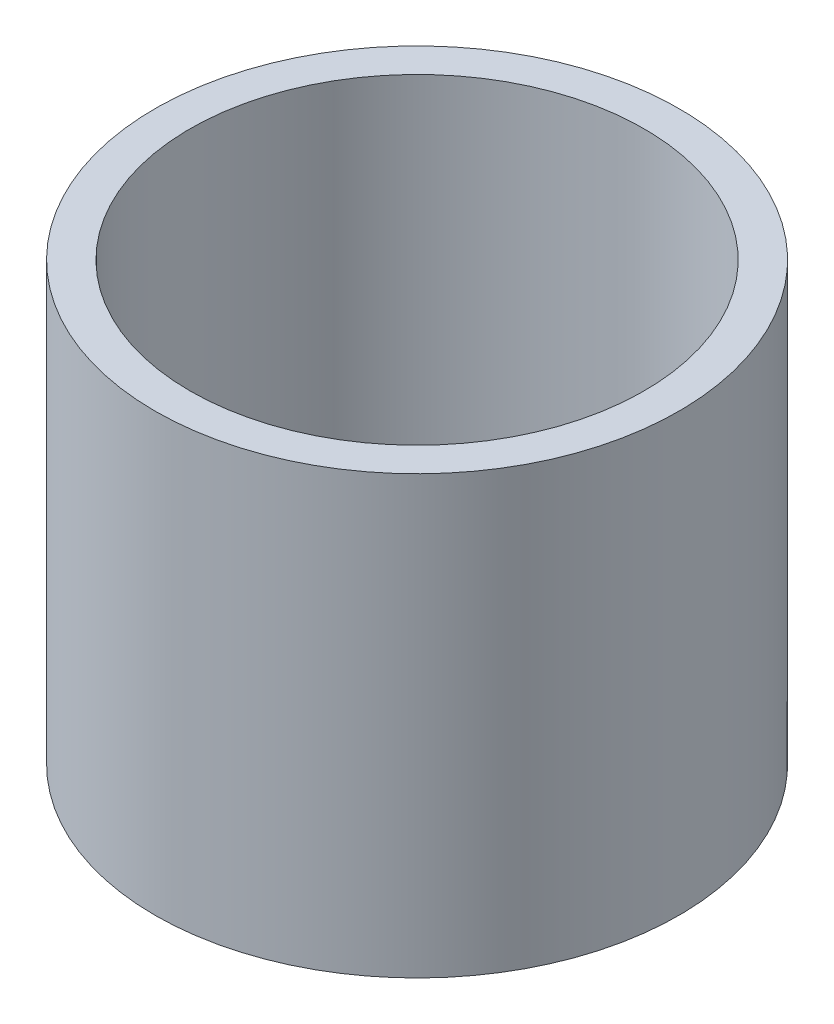
ISO-10303-21;
HEADER;
FILE_DESCRIPTION(('STEP AP214'),'2;1');
FILE_NAME('part.step','',(''),(''),'','','');
FILE_SCHEMA(('AUTOMOTIVE_DESIGN { 1 0 10303 214 1 1 1 1 }'));
ENDSEC;
DATA;
#1=APPLICATION_CONTEXT('core data for automotive mechanical design processes');
#2=APPLICATION_PROTOCOL_DEFINITION('international standard','automotive_design',2000,#1);
#3=PRODUCT_CONTEXT('',#1,'mechanical');
#4=PRODUCT('Part','Part','',(#3));
#5=PRODUCT_RELATED_PRODUCT_CATEGORY('part','',(#4));
#6=PRODUCT_DEFINITION_FORMATION('','',#4);
#7=PRODUCT_DEFINITION_CONTEXT('part definition',#1,'design');
#8=PRODUCT_DEFINITION('design','',#6,#7);
#9=PRODUCT_DEFINITION_SHAPE('','',#8);
#10=(LENGTH_UNIT() NAMED_UNIT(*) SI_UNIT(.MILLI.,.METRE.));
#11=(NAMED_UNIT(*) PLANE_ANGLE_UNIT() SI_UNIT($,.RADIAN.));
#12=(NAMED_UNIT(*) SI_UNIT($,.STERADIAN.) SOLID_ANGLE_UNIT());
#13=UNCERTAINTY_MEASURE_WITH_UNIT(LENGTH_MEASURE(1.E-05),#10,'distance_accuracy_value','');
#14=(GEOMETRIC_REPRESENTATION_CONTEXT(3) GLOBAL_UNCERTAINTY_ASSIGNED_CONTEXT((#13)) GLOBAL_UNIT_ASSIGNED_CONTEXT((#10,
#11,#12)) REPRESENTATION_CONTEXT('',''));
#15=CARTESIAN_POINT('',(0.,0.,0.));
#16=DIRECTION('',(0.,0.,1.));
#17=DIRECTION('',(1.,0.,0.));
#18=AXIS2_PLACEMENT_3D('',#15,#16,#17);
#19=CARTESIAN_POINT('',(0.,25.,0.));
#20=DIRECTION('',(0.,-1.,0.));
#21=DIRECTION('',(0.,0.,-1.));
#22=AXIS2_PLACEMENT_3D('',#19,#20,#21);
#23=CYLINDRICAL_SURFACE('',#22,15.);
#24=CARTESIAN_POINT('',(0.,25.,0.));
#25=DIRECTION('',(0.,1.,0.));
#26=DIRECTION('',(0.,0.,1.));
#27=AXIS2_PLACEMENT_3D('',#24,#25,#26);
#28=CIRCLE('',#27,15.);
#29=CARTESIAN_POINT('',(0.,25.,15.));
#30=VERTEX_POINT('',#29);
#31=EDGE_CURVE('E10',#30,#30,#28,.T.);
#32=ORIENTED_EDGE('',*,*,#31,.F.);
#33=EDGE_LOOP('',(#32));
#34=FACE_BOUND('',#33,.T.);
#35=CARTESIAN_POINT('',(0.,0.,0.));
#36=DIRECTION('',(0.,1.,0.));
#37=DIRECTION('',(0.,0.,1.));
#38=AXIS2_PLACEMENT_3D('',#35,#36,#37);
#39=CIRCLE('',#38,15.);
#40=CARTESIAN_POINT('',(0.,0.,15.));
#41=VERTEX_POINT('',#40);
#42=EDGE_CURVE('E40',#41,#41,#39,.T.);
#43=ORIENTED_EDGE('',*,*,#42,.T.);
#44=EDGE_LOOP('',(#43));
#45=FACE_BOUND('',#44,.T.);
#46=ADVANCED_FACE('F37',(#34,#45),#23,.T.);
#47=CARTESIAN_POINT('',(0.,25.,0.));
#48=DIRECTION('',(0.,1.,0.));
#49=DIRECTION('',(0.,0.,1.));
#50=AXIS2_PLACEMENT_3D('',#47,#48,#49);
#51=PLANE('',#50);
#52=CARTESIAN_POINT('',(0.,25.,0.));
#53=DIRECTION('',(0.,1.,0.));
#54=DIRECTION('',(0.,0.,1.));
#55=AXIS2_PLACEMENT_3D('',#52,#53,#54);
#56=CIRCLE('',#55,13.);
#57=CARTESIAN_POINT('',(0.,25.,13.));
#58=VERTEX_POINT('',#57);
#59=EDGE_CURVE('E51',#58,#58,#56,.T.);
#60=ORIENTED_EDGE('',*,*,#59,.F.);
#61=EDGE_LOOP('',(#60));
#62=FACE_BOUND('',#61,.T.);
#63=ORIENTED_EDGE('',*,*,#31,.T.);
#64=EDGE_LOOP('',(#63));
#65=FACE_BOUND('',#64,.T.);
#66=ADVANCED_FACE('F114',(#62,#65),#51,.T.);
#67=CARTESIAN_POINT('',(0.,0.,0.));
#68=DIRECTION('',(0.,1.,0.));
#69=DIRECTION('',(0.,0.,1.));
#70=AXIS2_PLACEMENT_3D('',#67,#68,#69);
#71=PLANE('',#70);
#72=CARTESIAN_POINT('',(10.,0.,0.));
#73=DIRECTION('',(0.,1.,0.));
#74=DIRECTION('',(0.,0.,1.));
#75=AXIS2_PLACEMENT_3D('',#72,#73,#74);
#76=CIRCLE('',#75,2.5);
#77=CARTESIAN_POINT('',(10.,0.,2.5));
#78=VERTEX_POINT('',#77);
#79=EDGE_CURVE('E55',#78,#78,#76,.T.);
#80=ORIENTED_EDGE('',*,*,#79,.T.);
#81=EDGE_LOOP('',(#80));
#82=FACE_BOUND('',#81,.T.);
#83=CARTESIAN_POINT('',(0.,0.,10.));
#84=DIRECTION('',(0.,1.,0.));
#85=DIRECTION('',(0.,0.,1.));
#86=AXIS2_PLACEMENT_3D('',#83,#84,#85);
#87=CIRCLE('',#86,2.5);
#88=CARTESIAN_POINT('',(0.,0.,12.5));
#89=VERTEX_POINT('',#88);
#90=EDGE_CURVE('E62',#89,#89,#87,.T.);
#91=ORIENTED_EDGE('',*,*,#90,.T.);
#92=EDGE_LOOP('',(#91));
#93=FACE_BOUND('',#92,.T.);
#94=CARTESIAN_POINT('',(-10.,0.,0.));
#95=DIRECTION('',(0.,1.,0.));
#96=DIRECTION('',(0.,0.,1.));
#97=AXIS2_PLACEMENT_3D('',#94,#95,#96);
#98=CIRCLE('',#97,2.5);
#99=CARTESIAN_POINT('',(-10.,0.,2.5));
#100=VERTEX_POINT('',#99);
#101=EDGE_CURVE('E66',#100,#100,#98,.T.);
#102=ORIENTED_EDGE('',*,*,#101,.T.);
#103=EDGE_LOOP('',(#102));
#104=FACE_BOUND('',#103,.T.);
#105=CARTESIAN_POINT('',(0.,0.,-10.));
#106=DIRECTION('',(0.,1.,0.));
#107=DIRECTION('',(0.,0.,1.));
#108=AXIS2_PLACEMENT_3D('',#105,#106,#107);
#109=CIRCLE('',#108,2.5);
#110=CARTESIAN_POINT('',(0.,0.,-7.5));
#111=VERTEX_POINT('',#110);
#112=EDGE_CURVE('E70',#111,#111,#109,.T.);
#113=ORIENTED_EDGE('',*,*,#112,.T.);
#114=EDGE_LOOP('',(#113));
#115=FACE_BOUND('',#114,.T.);
#116=ORIENTED_EDGE('',*,*,#42,.F.);
#117=EDGE_LOOP('',(#116));
#118=FACE_BOUND('',#117,.T.);
#119=ADVANCED_FACE('F110',(#82,#93,#104,#115,#118),#71,.F.);
#120=CARTESIAN_POINT('',(0.,3.,0.));
#121=DIRECTION('',(0.,1.,0.));
#122=DIRECTION('',(0.,0.,1.));
#123=AXIS2_PLACEMENT_3D('',#120,#121,#122);
#124=CYLINDRICAL_SURFACE('',#123,13.);
#125=CARTESIAN_POINT('',(0.,3.,0.));
#126=DIRECTION('',(0.,1.,0.));
#127=DIRECTION('',(0.,0.,1.));
#128=AXIS2_PLACEMENT_3D('',#125,#126,#127);
#129=CIRCLE('',#128,13.);
#130=CARTESIAN_POINT('',(0.,3.,13.));
#131=VERTEX_POINT('',#130);
#132=EDGE_CURVE('E49',#131,#131,#129,.T.);
#133=ORIENTED_EDGE('',*,*,#132,.F.);
#134=EDGE_LOOP('',(#133));
#135=FACE_BOUND('',#134,.T.);
#136=ORIENTED_EDGE('',*,*,#59,.T.);
#137=EDGE_LOOP('',(#136));
#138=FACE_BOUND('',#137,.T.);
#139=ADVANCED_FACE('F98',(#135,#138),#124,.F.);
#140=CARTESIAN_POINT('',(0.,3.,0.));
#141=DIRECTION('',(0.,1.,0.));
#142=DIRECTION('',(0.,0.,1.));
#143=AXIS2_PLACEMENT_3D('',#140,#141,#142);
#144=PLANE('',#143);
#145=CARTESIAN_POINT('',(10.,3.,0.));
#146=DIRECTION('',(0.,1.,0.));
#147=DIRECTION('',(0.,0.,1.));
#148=AXIS2_PLACEMENT_3D('',#145,#146,#147);
#149=CIRCLE('',#148,2.5);
#150=CARTESIAN_POINT('',(10.,3.,2.5));
#151=VERTEX_POINT('',#150);
#152=EDGE_CURVE('E74',#151,#151,#149,.T.);
#153=ORIENTED_EDGE('',*,*,#152,.F.);
#154=EDGE_LOOP('',(#153));
#155=FACE_BOUND('',#154,.T.);
#156=CARTESIAN_POINT('',(0.,3.,10.));
#157=DIRECTION('',(0.,1.,0.));
#158=DIRECTION('',(0.,0.,1.));
#159=AXIS2_PLACEMENT_3D('',#156,#157,#158);
#160=CIRCLE('',#159,2.5);
#161=CARTESIAN_POINT('',(0.,3.,12.5));
#162=VERTEX_POINT('',#161);
#163=EDGE_CURVE('E83',#162,#162,#160,.T.);
#164=ORIENTED_EDGE('',*,*,#163,.F.);
#165=EDGE_LOOP('',(#164));
#166=FACE_BOUND('',#165,.T.);
#167=CARTESIAN_POINT('',(-10.,3.,0.));
#168=DIRECTION('',(0.,1.,0.));
#169=DIRECTION('',(0.,0.,1.));
#170=AXIS2_PLACEMENT_3D('',#167,#168,#169);
#171=CIRCLE('',#170,2.5);
#172=CARTESIAN_POINT('',(-10.,3.,2.5));
#173=VERTEX_POINT('',#172);
#174=EDGE_CURVE('E79',#173,#173,#171,.T.);
#175=ORIENTED_EDGE('',*,*,#174,.F.);
#176=EDGE_LOOP('',(#175));
#177=FACE_BOUND('',#176,.T.);
#178=CARTESIAN_POINT('',(0.,3.,-10.));
#179=DIRECTION('',(0.,1.,0.));
#180=DIRECTION('',(0.,0.,1.));
#181=AXIS2_PLACEMENT_3D('',#178,#179,#180);
#182=CIRCLE('',#181,2.5);
#183=CARTESIAN_POINT('',(0.,3.,-7.5));
#184=VERTEX_POINT('',#183);
#185=EDGE_CURVE('E75',#184,#184,#182,.T.);
#186=ORIENTED_EDGE('',*,*,#185,.F.);
#187=EDGE_LOOP('',(#186));
#188=FACE_BOUND('',#187,.T.);
#189=ORIENTED_EDGE('',*,*,#132,.T.);
#190=EDGE_LOOP('',(#189));
#191=FACE_BOUND('',#190,.T.);
#192=ADVANCED_FACE('F94',(#155,#166,#177,#188,#191),#144,.T.);
#193=CARTESIAN_POINT('',(0.,-19.,-10.));
#194=DIRECTION('',(0.,1.,0.));
#195=DIRECTION('',(0.,0.,1.));
#196=AXIS2_PLACEMENT_3D('',#193,#194,#195);
#197=CYLINDRICAL_SURFACE('',#196,2.5);
#198=ORIENTED_EDGE('',*,*,#185,.T.);
#199=EDGE_LOOP('',(#198));
#200=FACE_BOUND('',#199,.T.);
#201=ORIENTED_EDGE('',*,*,#112,.F.);
#202=EDGE_LOOP('',(#201));
#203=FACE_BOUND('',#202,.T.);
#204=ADVANCED_FACE('F97',(#200,#203),#197,.F.);
#205=CARTESIAN_POINT('',(-10.,-19.,0.));
#206=DIRECTION('',(0.,1.,0.));
#207=DIRECTION('',(0.,0.,1.));
#208=AXIS2_PLACEMENT_3D('',#205,#206,#207);
#209=CYLINDRICAL_SURFACE('',#208,2.5);
#210=ORIENTED_EDGE('',*,*,#174,.T.);
#211=EDGE_LOOP('',(#210));
#212=FACE_BOUND('',#211,.T.);
#213=ORIENTED_EDGE('',*,*,#101,.F.);
#214=EDGE_LOOP('',(#213));
#215=FACE_BOUND('',#214,.T.);
#216=ADVANCED_FACE('F126',(#212,#215),#209,.F.);
#217=CARTESIAN_POINT('',(0.,-19.,10.));
#218=DIRECTION('',(0.,1.,0.));
#219=DIRECTION('',(0.,0.,1.));
#220=AXIS2_PLACEMENT_3D('',#217,#218,#219);
#221=CYLINDRICAL_SURFACE('',#220,2.5);
#222=ORIENTED_EDGE('',*,*,#163,.T.);
#223=EDGE_LOOP('',(#222));
#224=FACE_BOUND('',#223,.T.);
#225=ORIENTED_EDGE('',*,*,#90,.F.);
#226=EDGE_LOOP('',(#225));
#227=FACE_BOUND('',#226,.T.);
#228=ADVANCED_FACE('F130',(#224,#227),#221,.F.);
#229=CARTESIAN_POINT('',(10.,-19.,0.));
#230=DIRECTION('',(0.,1.,0.));
#231=DIRECTION('',(0.,0.,1.));
#232=AXIS2_PLACEMENT_3D('',#229,#230,#231);
#233=CYLINDRICAL_SURFACE('',#232,2.5);
#234=ORIENTED_EDGE('',*,*,#152,.T.);
#235=EDGE_LOOP('',(#234));
#236=FACE_BOUND('',#235,.T.);
#237=ORIENTED_EDGE('',*,*,#79,.F.);
#238=EDGE_LOOP('',(#237));
#239=FACE_BOUND('',#238,.T.);
#240=ADVANCED_FACE('F91',(#236,#239),#233,.F.);
#241=CLOSED_SHELL('',(#46,#66,#119,#139,#192,#204,#216,#228,#240));
#242=MANIFOLD_SOLID_BREP('B2',#241);
#243=ADVANCED_BREP_SHAPE_REPRESENTATION('',(#18,#242),#14);
#244=SHAPE_DEFINITION_REPRESENTATION(#9,#243);
ENDSEC;
END-ISO-10303-21;
